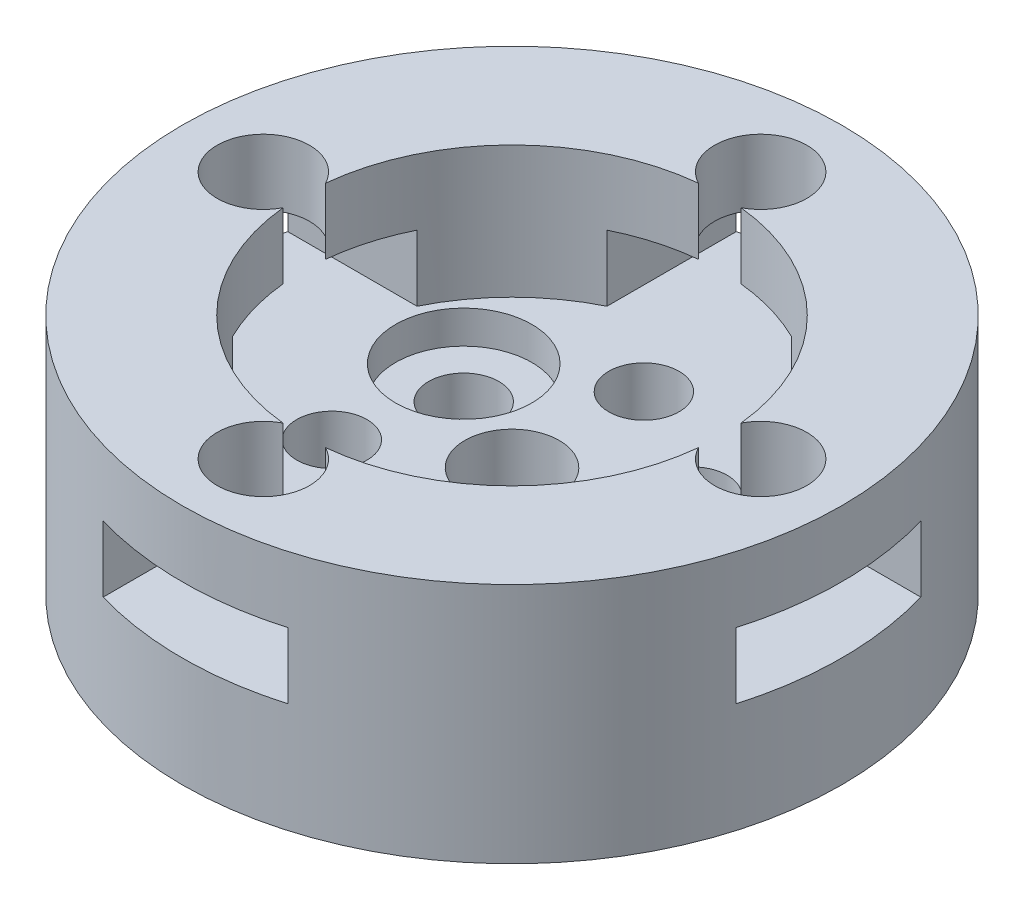
ISO-10303-21;
HEADER;
FILE_DESCRIPTION(('STEP AP214'),'2;1');
FILE_NAME('part.step','',(''),(''),'','','');
FILE_SCHEMA(('AUTOMOTIVE_DESIGN { 1 0 10303 214 1 1 1 1 }'));
ENDSEC;
DATA;
#1=APPLICATION_CONTEXT('core data for automotive mechanical design processes');
#2=APPLICATION_PROTOCOL_DEFINITION('international standard','automotive_design',2000,#1);
#3=PRODUCT_CONTEXT('',#1,'mechanical');
#4=PRODUCT('Part','Part','',(#3));
#5=PRODUCT_RELATED_PRODUCT_CATEGORY('part','',(#4));
#6=PRODUCT_DEFINITION_FORMATION('','',#4);
#7=PRODUCT_DEFINITION_CONTEXT('part definition',#1,'design');
#8=PRODUCT_DEFINITION('design','',#6,#7);
#9=PRODUCT_DEFINITION_SHAPE('','',#8);
#10=(LENGTH_UNIT() NAMED_UNIT(*) SI_UNIT(.MILLI.,.METRE.));
#11=(NAMED_UNIT(*) PLANE_ANGLE_UNIT() SI_UNIT($,.RADIAN.));
#12=(NAMED_UNIT(*) SI_UNIT($,.STERADIAN.) SOLID_ANGLE_UNIT());
#13=UNCERTAINTY_MEASURE_WITH_UNIT(LENGTH_MEASURE(1.E-05),#10,'distance_accuracy_value','');
#14=(GEOMETRIC_REPRESENTATION_CONTEXT(3) GLOBAL_UNCERTAINTY_ASSIGNED_CONTEXT((#13)) GLOBAL_UNIT_ASSIGNED_CONTEXT((#10,
#11,#12)) REPRESENTATION_CONTEXT('',''));
#15=CARTESIAN_POINT('',(0.,0.,0.));
#16=DIRECTION('',(0.,0.,1.));
#17=DIRECTION('',(1.,0.,0.));
#18=AXIS2_PLACEMENT_3D('',#15,#16,#17);
#19=CARTESIAN_POINT('',(0.,11.,0.));
#20=DIRECTION('',(0.,-1.,0.));
#21=DIRECTION('',(0.,0.,-1.));
#22=AXIS2_PLACEMENT_3D('',#19,#20,#21);
#23=CYLINDRICAL_SURFACE('',#22,15.);
#24=CARTESIAN_POINT('',(0.,5.,0.));
#25=DIRECTION('',(0.,-1.,0.));
#26=DIRECTION('',(0.,0.,-1.));
#27=AXIS2_PLACEMENT_3D('',#24,#25,#26);
#28=CIRCLE('',#27,15.);
#29=CARTESIAN_POINT('',(4.19999999999991,5.,-14.4));
#30=VERTEX_POINT('',#29);
#31=CARTESIAN_POINT('',(-4.20000000000009,5.,-14.4));
#32=VERTEX_POINT('',#31);
#33=EDGE_CURVE('E265',#30,#32,#28,.F.);
#34=ORIENTED_EDGE('',*,*,#33,.F.);
#35=DIRECTION('',(0.,-1.,0.));
#36=VECTOR('',#35,1.);
#37=CARTESIAN_POINT('',(4.19999999999991,11.,-14.4));
#38=LINE('',#37,#36);
#39=CARTESIAN_POINT('',(4.19999999999991,8.,-14.4));
#40=VERTEX_POINT('',#39);
#41=EDGE_CURVE('E269',#40,#30,#38,.T.);
#42=ORIENTED_EDGE('',*,*,#41,.F.);
#43=CARTESIAN_POINT('',(0.,8.,0.));
#44=DIRECTION('',(0.,-1.,0.));
#45=DIRECTION('',(0.,0.,-1.));
#46=AXIS2_PLACEMENT_3D('',#43,#44,#45);
#47=CIRCLE('',#46,15.);
#48=CARTESIAN_POINT('',(-4.20000000000009,8.,-14.4));
#49=VERTEX_POINT('',#48);
#50=EDGE_CURVE('E215',#40,#49,#47,.F.);
#51=ORIENTED_EDGE('',*,*,#50,.T.);
#52=DIRECTION('',(0.,-1.,0.));
#53=VECTOR('',#52,1.);
#54=CARTESIAN_POINT('',(-4.20000000000009,11.,-14.4));
#55=LINE('',#54,#53);
#56=EDGE_CURVE('E267',#32,#49,#55,.F.);
#57=ORIENTED_EDGE('',*,*,#56,.F.);
#58=EDGE_LOOP('',(#34,#42,#51,#57));
#59=FACE_BOUND('',#58,.T.);
#60=CARTESIAN_POINT('',(0.,5.,0.));
#61=DIRECTION('',(0.,-1.,0.));
#62=DIRECTION('',(0.,0.,-1.));
#63=AXIS2_PLACEMENT_3D('',#60,#61,#62);
#64=CIRCLE('',#63,15.);
#65=CARTESIAN_POINT('',(14.4000000000001,5.,4.19999999999958));
#66=VERTEX_POINT('',#65);
#67=CARTESIAN_POINT('',(14.3999999999999,5.,-4.20000000000042));
#68=VERTEX_POINT('',#67);
#69=EDGE_CURVE('E258',#66,#68,#64,.F.);
#70=ORIENTED_EDGE('',*,*,#69,.F.);
#71=DIRECTION('',(0.,-1.,0.));
#72=VECTOR('',#71,1.);
#73=CARTESIAN_POINT('',(14.4000000000001,11.,4.19999999999958));
#74=LINE('',#73,#72);
#75=CARTESIAN_POINT('',(14.4000000000001,8.,4.19999999999958));
#76=VERTEX_POINT('',#75);
#77=EDGE_CURVE('E263',#76,#66,#74,.T.);
#78=ORIENTED_EDGE('',*,*,#77,.F.);
#79=CARTESIAN_POINT('',(0.,8.,0.));
#80=DIRECTION('',(0.,-1.,0.));
#81=DIRECTION('',(0.,0.,-1.));
#82=AXIS2_PLACEMENT_3D('',#79,#80,#81);
#83=CIRCLE('',#82,15.);
#84=CARTESIAN_POINT('',(14.3999999999999,8.,-4.20000000000042));
#85=VERTEX_POINT('',#84);
#86=EDGE_CURVE('E236',#76,#85,#83,.F.);
#87=ORIENTED_EDGE('',*,*,#86,.T.);
#88=DIRECTION('',(0.,-1.,0.));
#89=VECTOR('',#88,1.);
#90=CARTESIAN_POINT('',(14.3999999999999,11.,-4.20000000000042));
#91=LINE('',#90,#89);
#92=EDGE_CURVE('E260',#68,#85,#91,.F.);
#93=ORIENTED_EDGE('',*,*,#92,.F.);
#94=EDGE_LOOP('',(#70,#78,#87,#93));
#95=FACE_BOUND('',#94,.T.);
#96=CARTESIAN_POINT('',(0.,5.,0.));
#97=DIRECTION('',(0.,-1.,0.));
#98=DIRECTION('',(0.,0.,-1.));
#99=AXIS2_PLACEMENT_3D('',#96,#97,#98);
#100=CIRCLE('',#99,15.);
#101=CARTESIAN_POINT('',(-4.19999999999967,5.,14.4000000000001));
#102=VERTEX_POINT('',#101);
#103=CARTESIAN_POINT('',(4.20000000000033,5.,14.3999999999999));
#104=VERTEX_POINT('',#103);
#105=EDGE_CURVE('E251',#102,#104,#100,.F.);
#106=ORIENTED_EDGE('',*,*,#105,.F.);
#107=DIRECTION('',(0.,-1.,0.));
#108=VECTOR('',#107,1.);
#109=CARTESIAN_POINT('',(-4.19999999999967,11.,14.4000000000001));
#110=LINE('',#109,#108);
#111=CARTESIAN_POINT('',(-4.19999999999967,8.,14.4000000000001));
#112=VERTEX_POINT('',#111);
#113=EDGE_CURVE('E256',#112,#102,#110,.T.);
#114=ORIENTED_EDGE('',*,*,#113,.F.);
#115=CARTESIAN_POINT('',(0.,8.,0.));
#116=DIRECTION('',(0.,-1.,0.));
#117=DIRECTION('',(0.,0.,-1.));
#118=AXIS2_PLACEMENT_3D('',#115,#116,#117);
#119=CIRCLE('',#118,15.);
#120=CARTESIAN_POINT('',(4.20000000000033,8.,14.3999999999999));
#121=VERTEX_POINT('',#120);
#122=EDGE_CURVE('E242',#112,#121,#119,.F.);
#123=ORIENTED_EDGE('',*,*,#122,.T.);
#124=DIRECTION('',(0.,-1.,0.));
#125=VECTOR('',#124,1.);
#126=CARTESIAN_POINT('',(4.20000000000033,11.,14.3999999999999));
#127=LINE('',#126,#125);
#128=EDGE_CURVE('E253',#104,#121,#127,.F.);
#129=ORIENTED_EDGE('',*,*,#128,.F.);
#130=EDGE_LOOP('',(#106,#114,#123,#129));
#131=FACE_BOUND('',#130,.T.);
#132=CARTESIAN_POINT('',(0.,11.,0.));
#133=DIRECTION('',(0.,-1.,0.));
#134=DIRECTION('',(0.,0.,-1.));
#135=AXIS2_PLACEMENT_3D('',#132,#133,#134);
#136=CIRCLE('',#135,15.);
#137=CARTESIAN_POINT('',(0.,11.,-15.));
#138=VERTEX_POINT('',#137);
#139=EDGE_CURVE('E300',#138,#138,#136,.T.);
#140=ORIENTED_EDGE('',*,*,#139,.T.);
#141=EDGE_LOOP('',(#140));
#142=FACE_BOUND('',#141,.T.);
#143=CARTESIAN_POINT('',(0.,0.,0.));
#144=DIRECTION('',(0.,-1.,0.));
#145=DIRECTION('',(0.,0.,-1.));
#146=AXIS2_PLACEMENT_3D('',#143,#144,#145);
#147=CIRCLE('',#146,15.);
#148=CARTESIAN_POINT('',(0.,0.,-15.));
#149=VERTEX_POINT('',#148);
#150=EDGE_CURVE('E298',#149,#149,#147,.T.);
#151=ORIENTED_EDGE('',*,*,#150,.F.);
#152=EDGE_LOOP('',(#151));
#153=FACE_BOUND('',#152,.T.);
#154=DIRECTION('',(0.,-1.,0.));
#155=VECTOR('',#154,1.);
#156=CARTESIAN_POINT('',(-14.4,11.,4.2));
#157=LINE('',#156,#155);
#158=CARTESIAN_POINT('',(-14.4,5.,4.2));
#159=VERTEX_POINT('',#158);
#160=CARTESIAN_POINT('',(-14.4,8.,4.2));
#161=VERTEX_POINT('',#160);
#162=EDGE_CURVE('E274',#159,#161,#157,.F.);
#163=ORIENTED_EDGE('',*,*,#162,.F.);
#164=CARTESIAN_POINT('',(0.,5.,0.));
#165=DIRECTION('',(0.,1.,0.));
#166=DIRECTION('',(0.,0.,1.));
#167=AXIS2_PLACEMENT_3D('',#164,#165,#166);
#168=CIRCLE('',#167,15.);
#169=CARTESIAN_POINT('',(-14.4,5.,-4.2));
#170=VERTEX_POINT('',#169);
#171=EDGE_CURVE('E271',#159,#170,#168,.F.);
#172=ORIENTED_EDGE('',*,*,#171,.T.);
#173=DIRECTION('',(0.,-1.,0.));
#174=VECTOR('',#173,1.);
#175=CARTESIAN_POINT('',(-14.4,11.,-4.2));
#176=LINE('',#175,#174);
#177=CARTESIAN_POINT('',(-14.4,8.,-4.2));
#178=VERTEX_POINT('',#177);
#179=EDGE_CURVE('E276',#178,#170,#176,.T.);
#180=ORIENTED_EDGE('',*,*,#179,.F.);
#181=CARTESIAN_POINT('',(0.,8.,0.));
#182=DIRECTION('',(0.,1.,0.));
#183=DIRECTION('',(0.,0.,1.));
#184=AXIS2_PLACEMENT_3D('',#181,#182,#183);
#185=CIRCLE('',#184,15.);
#186=EDGE_CURVE('E249',#161,#178,#185,.F.);
#187=ORIENTED_EDGE('',*,*,#186,.F.);
#188=EDGE_LOOP('',(#163,#172,#180,#187));
#189=FACE_BOUND('',#188,.T.);
#190=ADVANCED_FACE('F36',(#59,#95,#131,#142,#153,#189),#23,.T.);
#191=CARTESIAN_POINT('',(0.,11.,0.));
#192=DIRECTION('',(0.,-1.,0.));
#193=DIRECTION('',(0.,0.,-1.));
#194=AXIS2_PLACEMENT_3D('',#191,#192,#193);
#195=CYLINDRICAL_SURFACE('',#194,9.5);
#196=CARTESIAN_POINT('',(0.,5.,0.));
#197=DIRECTION('',(0.,1.,0.));
#198=DIRECTION('',(0.,0.,1.));
#199=AXIS2_PLACEMENT_3D('',#196,#197,#198);
#200=CIRCLE('',#199,9.5);
#201=CARTESIAN_POINT('',(-8.52115015710907,5.,4.2));
#202=VERTEX_POINT('',#201);
#203=CARTESIAN_POINT('',(-4.19999999999967,5.,8.52115015710923));
#204=VERTEX_POINT('',#203);
#205=EDGE_CURVE('E303',#202,#204,#200,.T.);
#206=ORIENTED_EDGE('',*,*,#205,.F.);
#207=DIRECTION('',(0.,-1.,0.));
#208=VECTOR('',#207,1.);
#209=CARTESIAN_POINT('',(-8.52115015710907,11.,4.2));
#210=LINE('',#209,#208);
#211=CARTESIAN_POINT('',(-8.52115015710907,8.,4.2));
#212=VERTEX_POINT('',#211);
#213=EDGE_CURVE('E11',#202,#212,#210,.F.);
#214=ORIENTED_EDGE('',*,*,#213,.T.);
#215=CARTESIAN_POINT('',(0.,8.,0.));
#216=DIRECTION('',(0.,1.,0.));
#217=DIRECTION('',(0.,0.,1.));
#218=AXIS2_PLACEMENT_3D('',#215,#216,#217);
#219=CIRCLE('',#218,9.5);
#220=CARTESIAN_POINT('',(-9.45048213055818,8.,0.968704031167638));
#221=VERTEX_POINT('',#220);
#222=EDGE_CURVE('E248',#212,#221,#219,.F.);
#223=ORIENTED_EDGE('',*,*,#222,.T.);
#224=DIRECTION('',(0.,1.,0.));
#225=VECTOR('',#224,1.);
#226=CARTESIAN_POINT('',(-9.45048213055818,9.5,0.968704031167638));
#227=LINE('',#226,#225);
#228=CARTESIAN_POINT('',(-9.45048213055818,11.,0.968704031167637));
#229=VERTEX_POINT('',#228);
#230=EDGE_CURVE('E358',#221,#229,#227,.T.);
#231=ORIENTED_EDGE('',*,*,#230,.T.);
#232=CARTESIAN_POINT('',(0.,11.,0.));
#233=DIRECTION('',(0.,-1.,0.));
#234=DIRECTION('',(0.,0.,-1.));
#235=AXIS2_PLACEMENT_3D('',#232,#233,#234);
#236=CIRCLE('',#235,9.5);
#237=CARTESIAN_POINT('',(-0.968704031167536,11.,9.45048213055819));
#238=VERTEX_POINT('',#237);
#239=EDGE_CURVE('E840',#238,#229,#236,.T.);
#240=ORIENTED_EDGE('',*,*,#239,.F.);
#241=DIRECTION('',(0.,1.,0.));
#242=VECTOR('',#241,1.);
#243=CARTESIAN_POINT('',(-0.96870403116754,9.5,9.4504821305582));
#244=LINE('',#243,#242);
#245=CARTESIAN_POINT('',(-0.968704031167536,8.,9.45048213055819));
#246=VERTEX_POINT('',#245);
#247=EDGE_CURVE('E373',#238,#246,#244,.F.);
#248=ORIENTED_EDGE('',*,*,#247,.T.);
#249=CARTESIAN_POINT('',(0.,8.,0.));
#250=DIRECTION('',(0.,-1.,0.));
#251=DIRECTION('',(0.,0.,-1.));
#252=AXIS2_PLACEMENT_3D('',#249,#250,#251);
#253=CIRCLE('',#252,9.5);
#254=CARTESIAN_POINT('',(-4.19999999999967,8.,8.52115015710923));
#255=VERTEX_POINT('',#254);
#256=EDGE_CURVE('E241',#255,#246,#253,.F.);
#257=ORIENTED_EDGE('',*,*,#256,.F.);
#258=DIRECTION('',(0.,-1.,0.));
#259=VECTOR('',#258,1.);
#260=CARTESIAN_POINT('',(-4.19999999999967,11.,8.52115015710923));
#261=LINE('',#260,#259);
#262=EDGE_CURVE('E389',#255,#204,#261,.T.);
#263=ORIENTED_EDGE('',*,*,#262,.T.);
#264=EDGE_LOOP('',(#206,#214,#223,#231,#240,#248,#257,#263));
#265=FACE_BOUND('',#264,.T.);
#266=ADVANCED_FACE('F421',(#265),#195,.F.);
#267=CARTESIAN_POINT('',(-9.45048213055819,8.,-0.96870403116762));
#268=VERTEX_POINT('',#267);
#269=CARTESIAN_POINT('',(-8.52115015710907,8.,-4.2));
#270=VERTEX_POINT('',#269);
#271=EDGE_CURVE('E245',#268,#270,#219,.F.);
#272=ORIENTED_EDGE('',*,*,#271,.T.);
#273=DIRECTION('',(0.,-1.,0.));
#274=VECTOR('',#273,1.);
#275=CARTESIAN_POINT('',(-8.52115015710907,11.,-4.2));
#276=LINE('',#275,#274);
#277=CARTESIAN_POINT('',(-8.52115015710907,5.,-4.2));
#278=VERTEX_POINT('',#277);
#279=EDGE_CURVE('E44',#270,#278,#276,.T.);
#280=ORIENTED_EDGE('',*,*,#279,.T.);
#281=CARTESIAN_POINT('',(-4.20000000000009,5.,-8.52115015710903));
#282=VERTEX_POINT('',#281);
#283=EDGE_CURVE('E403',#282,#278,#200,.T.);
#284=ORIENTED_EDGE('',*,*,#283,.F.);
#285=DIRECTION('',(0.,-1.,0.));
#286=VECTOR('',#285,1.);
#287=CARTESIAN_POINT('',(-4.20000000000009,11.,-8.52115015710903));
#288=LINE('',#287,#286);
#289=CARTESIAN_POINT('',(-4.20000000000009,8.,-8.52115015710903));
#290=VERTEX_POINT('',#289);
#291=EDGE_CURVE('E208',#282,#290,#288,.F.);
#292=ORIENTED_EDGE('',*,*,#291,.T.);
#293=CARTESIAN_POINT('',(0.,8.,0.));
#294=DIRECTION('',(0.,-1.,0.));
#295=DIRECTION('',(0.,0.,-1.));
#296=AXIS2_PLACEMENT_3D('',#293,#294,#295);
#297=CIRCLE('',#296,9.5);
#298=CARTESIAN_POINT('',(-0.968704031167415,8.,-9.45048213055821));
#299=VERTEX_POINT('',#298);
#300=EDGE_CURVE('E222',#299,#290,#297,.F.);
#301=ORIENTED_EDGE('',*,*,#300,.F.);
#302=DIRECTION('',(0.,1.,0.));
#303=VECTOR('',#302,1.);
#304=CARTESIAN_POINT('',(-0.968704031167414,9.5,-9.45048213055821));
#305=LINE('',#304,#303);
#306=CARTESIAN_POINT('',(-0.968704031167415,11.,-9.45048213055821));
#307=VERTEX_POINT('',#306);
#308=EDGE_CURVE('E382',#299,#307,#305,.T.);
#309=ORIENTED_EDGE('',*,*,#308,.T.);
#310=CARTESIAN_POINT('',(-9.45048213055819,11.,-0.96870403116762));
#311=VERTEX_POINT('',#310);
#312=EDGE_CURVE('E281',#311,#307,#236,.T.);
#313=ORIENTED_EDGE('',*,*,#312,.F.);
#314=DIRECTION('',(0.,1.,0.));
#315=VECTOR('',#314,1.);
#316=CARTESIAN_POINT('',(-9.45048213055819,9.5,-0.96870403116762));
#317=LINE('',#316,#315);
#318=EDGE_CURVE('E367',#311,#268,#317,.F.);
#319=ORIENTED_EDGE('',*,*,#318,.T.);
#320=EDGE_LOOP('',(#272,#280,#284,#292,#301,#309,#313,#319));
#321=FACE_BOUND('',#320,.T.);
#322=ADVANCED_FACE('F402',(#321),#195,.F.);
#323=CARTESIAN_POINT('',(0.,8.,0.));
#324=DIRECTION('',(0.,-1.,0.));
#325=DIRECTION('',(0.,0.,-1.));
#326=AXIS2_PLACEMENT_3D('',#323,#324,#325);
#327=CIRCLE('',#326,9.5);
#328=CARTESIAN_POINT('',(8.52115015710928,8.,4.19999999999958));
#329=VERTEX_POINT('',#328);
#330=CARTESIAN_POINT('',(9.4504821305582,8.,0.968704031167484));
#331=VERTEX_POINT('',#330);
#332=EDGE_CURVE('E235',#329,#331,#327,.F.);
#333=ORIENTED_EDGE('',*,*,#332,.F.);
#334=DIRECTION('',(0.,-1.,0.));
#335=VECTOR('',#334,1.);
#336=CARTESIAN_POINT('',(8.52115015710928,11.,4.19999999999958));
#337=LINE('',#336,#335);
#338=CARTESIAN_POINT('',(8.52115015710928,5.,4.19999999999958));
#339=VERTEX_POINT('',#338);
#340=EDGE_CURVE('E209',#329,#339,#337,.T.);
#341=ORIENTED_EDGE('',*,*,#340,.T.);
#342=CARTESIAN_POINT('',(4.20000000000033,5.,8.52115015710891));
#343=VERTEX_POINT('',#342);
#344=EDGE_CURVE('E306',#343,#339,#200,.T.);
#345=ORIENTED_EDGE('',*,*,#344,.F.);
#346=DIRECTION('',(0.,-1.,0.));
#347=VECTOR('',#346,1.);
#348=CARTESIAN_POINT('',(4.20000000000033,11.,8.52115015710891));
#349=LINE('',#348,#347);
#350=CARTESIAN_POINT('',(4.20000000000033,8.,8.52115015710891));
#351=VERTEX_POINT('',#350);
#352=EDGE_CURVE('E386',#343,#351,#349,.F.);
#353=ORIENTED_EDGE('',*,*,#352,.T.);
#354=CARTESIAN_POINT('',(0.968704031167545,8.,9.45048213055819));
#355=VERTEX_POINT('',#354);
#356=EDGE_CURVE('E239',#355,#351,#253,.F.);
#357=ORIENTED_EDGE('',*,*,#356,.F.);
#358=DIRECTION('',(0.,1.,0.));
#359=VECTOR('',#358,1.);
#360=CARTESIAN_POINT('',(0.968704031167549,9.5,9.4504821305582));
#361=LINE('',#360,#359);
#362=CARTESIAN_POINT('',(0.968704031167545,11.,9.45048213055819));
#363=VERTEX_POINT('',#362);
#364=EDGE_CURVE('E370',#355,#363,#361,.T.);
#365=ORIENTED_EDGE('',*,*,#364,.T.);
#366=CARTESIAN_POINT('',(9.4504821305582,11.,0.968704031167484));
#367=VERTEX_POINT('',#366);
#368=EDGE_CURVE('E299',#367,#363,#236,.T.);
#369=ORIENTED_EDGE('',*,*,#368,.F.);
#370=DIRECTION('',(0.,1.,0.));
#371=VECTOR('',#370,1.);
#372=CARTESIAN_POINT('',(9.45048213055821,9.5,0.968704031167491));
#373=LINE('',#372,#371);
#374=EDGE_CURVE('E379',#367,#331,#373,.F.);
#375=ORIENTED_EDGE('',*,*,#374,.T.);
#376=EDGE_LOOP('',(#333,#341,#345,#353,#357,#365,#369,#375));
#377=FACE_BOUND('',#376,.T.);
#378=ADVANCED_FACE('F530',(#377),#195,.F.);
#379=CARTESIAN_POINT('',(0.,5.,0.));
#380=DIRECTION('',(0.,1.,0.));
#381=DIRECTION('',(0.,0.,1.));
#382=AXIS2_PLACEMENT_3D('',#379,#380,#381);
#383=PLANE('',#382);
#384=ORIENTED_EDGE('',*,*,#283,.T.);
#385=DIRECTION('',(-1.,0.,0.));
#386=VECTOR('',#385,1.);
#387=CARTESIAN_POINT('',(-17.3137084989848,5.,-4.2));
#388=LINE('',#387,#386);
#389=EDGE_CURVE('E223',#278,#170,#388,.T.);
#390=ORIENTED_EDGE('',*,*,#389,.T.);
#391=ORIENTED_EDGE('',*,*,#171,.F.);
#392=DIRECTION('',(1.,0.,0.));
#393=VECTOR('',#392,1.);
#394=CARTESIAN_POINT('',(-17.3137084989848,5.,4.2));
#395=LINE('',#394,#393);
#396=EDGE_CURVE('E226',#159,#202,#395,.T.);
#397=ORIENTED_EDGE('',*,*,#396,.T.);
#398=ORIENTED_EDGE('',*,*,#205,.T.);
#399=DIRECTION('',(0.,0.,1.));
#400=VECTOR('',#399,1.);
#401=CARTESIAN_POINT('',(-4.19999999999967,5.,17.3137084989847));
#402=LINE('',#401,#400);
#403=EDGE_CURVE('E417',#204,#102,#402,.T.);
#404=ORIENTED_EDGE('',*,*,#403,.T.);
#405=ORIENTED_EDGE('',*,*,#105,.T.);
#406=DIRECTION('',(0.,0.,-1.));
#407=VECTOR('',#406,1.);
#408=CARTESIAN_POINT('',(4.20000000000033,5.,17.3137084989847));
#409=LINE('',#408,#407);
#410=EDGE_CURVE('E435',#104,#343,#409,.T.);
#411=ORIENTED_EDGE('',*,*,#410,.T.);
#412=ORIENTED_EDGE('',*,*,#344,.T.);
#413=DIRECTION('',(1.,0.,0.));
#414=VECTOR('',#413,1.);
#415=CARTESIAN_POINT('',(17.313708498985,5.,4.19999999999958));
#416=LINE('',#415,#414);
#417=EDGE_CURVE('E443',#339,#66,#416,.T.);
#418=ORIENTED_EDGE('',*,*,#417,.T.);
#419=ORIENTED_EDGE('',*,*,#69,.T.);
#420=DIRECTION('',(-1.,0.,0.));
#421=VECTOR('',#420,1.);
#422=CARTESIAN_POINT('',(17.313708498985,5.,-4.20000000000042));
#423=LINE('',#422,#421);
#424=CARTESIAN_POINT('',(8.52115015710887,5.,-4.20000000000042));
#425=VERTEX_POINT('',#424);
#426=EDGE_CURVE('E216',#68,#425,#423,.T.);
#427=ORIENTED_EDGE('',*,*,#426,.T.);
#428=CARTESIAN_POINT('',(4.19999999999991,5.,-8.52115015710912));
#429=VERTEX_POINT('',#428);
#430=EDGE_CURVE('E310',#425,#429,#200,.T.);
#431=ORIENTED_EDGE('',*,*,#430,.T.);
#432=DIRECTION('',(0.,0.,-1.));
#433=VECTOR('',#432,1.);
#434=CARTESIAN_POINT('',(4.19999999999991,5.,-17.3137084989851));
#435=LINE('',#434,#433);
#436=EDGE_CURVE('E203',#429,#30,#435,.T.);
#437=ORIENTED_EDGE('',*,*,#436,.T.);
#438=ORIENTED_EDGE('',*,*,#33,.T.);
#439=DIRECTION('',(0.,0.,1.));
#440=VECTOR('',#439,1.);
#441=CARTESIAN_POINT('',(-4.20000000000009,5.,-17.3137084989851));
#442=LINE('',#441,#440);
#443=EDGE_CURVE('E412',#32,#282,#442,.T.);
#444=ORIENTED_EDGE('',*,*,#443,.T.);
#445=EDGE_LOOP('',(#384,#390,#391,#397,#398,#404,#405,#411,#412,#418,#419,#427,#431,#437,#438,#444));
#446=FACE_BOUND('',#445,.T.);
#447=CARTESIAN_POINT('',(-5.19615242270664,5.,-3.));
#448=DIRECTION('',(0.,1.,0.));
#449=DIRECTION('',(0.,0.,1.));
#450=AXIS2_PLACEMENT_3D('',#447,#448,#449);
#451=CIRCLE('',#450,3.1);
#452=CARTESIAN_POINT('',(-5.19615242270664,5.,0.100000000000003));
#453=VERTEX_POINT('',#452);
#454=EDGE_CURVE('E315',#453,#453,#451,.T.);
#455=ORIENTED_EDGE('',*,*,#454,.F.);
#456=EDGE_LOOP('',(#455));
#457=FACE_BOUND('',#456,.T.);
#458=CARTESIAN_POINT('',(0.,5.,-6.));
#459=DIRECTION('',(0.,1.,0.));
#460=DIRECTION('',(0.,0.,1.));
#461=AXIS2_PLACEMENT_3D('',#458,#459,#460);
#462=CIRCLE('',#461,1.6);
#463=CARTESIAN_POINT('',(0.,5.,-4.4));
#464=VERTEX_POINT('',#463);
#465=EDGE_CURVE('E355',#464,#464,#462,.T.);
#466=ORIENTED_EDGE('',*,*,#465,.F.);
#467=EDGE_LOOP('',(#466));
#468=FACE_BOUND('',#467,.T.);
#469=CARTESIAN_POINT('',(5.19615242270637,5.,2.99999999999986));
#470=DIRECTION('',(0.,1.,0.));
#471=DIRECTION('',(0.,0.,1.));
#472=AXIS2_PLACEMENT_3D('',#469,#470,#471);
#473=CIRCLE('',#472,3.10000000000013);
#474=CARTESIAN_POINT('',(5.19615242270637,5.,6.09999999999998));
#475=VERTEX_POINT('',#474);
#476=EDGE_CURVE('E309',#475,#475,#473,.T.);
#477=ORIENTED_EDGE('',*,*,#476,.F.);
#478=EDGE_LOOP('',(#477));
#479=FACE_BOUND('',#478,.T.);
#480=CARTESIAN_POINT('',(0.,5.,6.));
#481=DIRECTION('',(0.,1.,0.));
#482=DIRECTION('',(0.,0.,1.));
#483=AXIS2_PLACEMENT_3D('',#480,#481,#482);
#484=CIRCLE('',#483,1.6);
#485=CARTESIAN_POINT('',(0.,5.,7.6));
#486=VERTEX_POINT('',#485);
#487=EDGE_CURVE('E334',#486,#486,#484,.T.);
#488=ORIENTED_EDGE('',*,*,#487,.F.);
#489=EDGE_LOOP('',(#488));
#490=FACE_BOUND('',#489,.T.);
#491=CARTESIAN_POINT('',(5.19615242270663,5.,-3.));
#492=DIRECTION('',(0.,1.,0.));
#493=DIRECTION('',(0.,0.,1.));
#494=AXIS2_PLACEMENT_3D('',#491,#492,#493);
#495=CIRCLE('',#494,1.6);
#496=CARTESIAN_POINT('',(5.19615242270663,5.,-1.4));
#497=VERTEX_POINT('',#496);
#498=EDGE_CURVE('E343',#497,#497,#495,.T.);
#499=ORIENTED_EDGE('',*,*,#498,.F.);
#500=EDGE_LOOP('',(#499));
#501=FACE_BOUND('',#500,.T.);
#502=CARTESIAN_POINT('',(0.,5.,0.));
#503=DIRECTION('',(0.,1.,0.));
#504=DIRECTION('',(0.,0.,1.));
#505=AXIS2_PLACEMENT_3D('',#502,#503,#504);
#506=CIRCLE('',#505,2.15);
#507=CARTESIAN_POINT('',(0.,5.,2.15));
#508=VERTEX_POINT('',#507);
#509=EDGE_CURVE('E349',#508,#508,#506,.T.);
#510=ORIENTED_EDGE('',*,*,#509,.F.);
#511=EDGE_LOOP('',(#510));
#512=FACE_BOUND('',#511,.T.);
#513=CARTESIAN_POINT('',(-5.19615242270663,5.,3.));
#514=DIRECTION('',(0.,1.,0.));
#515=DIRECTION('',(0.,0.,1.));
#516=AXIS2_PLACEMENT_3D('',#513,#514,#515);
#517=CIRCLE('',#516,1.6);
#518=CARTESIAN_POINT('',(-5.19615242270663,5.,4.6));
#519=VERTEX_POINT('',#518);
#520=EDGE_CURVE('E328',#519,#519,#517,.T.);
#521=ORIENTED_EDGE('',*,*,#520,.F.);
#522=EDGE_LOOP('',(#521));
#523=FACE_BOUND('',#522,.T.);
#524=ADVANCED_FACE('F409',(#446,#457,#468,#479,#490,#501,#512,#523),#383,.T.);
#525=CARTESIAN_POINT('',(5.19615242270663,5.,3.));
#526=DIRECTION('',(0.,-1.,0.));
#527=DIRECTION('',(0.,0.,-1.));
#528=AXIS2_PLACEMENT_3D('',#525,#526,#527);
#529=CYLINDRICAL_SURFACE('',#528,1.6);
#530=CARTESIAN_POINT('',(5.19615242270663,0.,3.));
#531=DIRECTION('',(0.,1.,0.));
#532=DIRECTION('',(0.,0.,1.));
#533=AXIS2_PLACEMENT_3D('',#530,#531,#532);
#534=CIRCLE('',#533,1.6);
#535=CARTESIAN_POINT('',(5.19615242270663,0.,4.6));
#536=VERTEX_POINT('',#535);
#537=EDGE_CURVE('E337',#536,#536,#534,.T.);
#538=ORIENTED_EDGE('',*,*,#537,.F.);
#539=EDGE_LOOP('',(#538));
#540=FACE_BOUND('',#539,.T.);
#541=CARTESIAN_POINT('',(5.19615242270663,3.5,3.));
#542=DIRECTION('',(0.,1.,0.));
#543=DIRECTION('',(0.,0.,1.));
#544=AXIS2_PLACEMENT_3D('',#541,#542,#543);
#545=CIRCLE('',#544,1.6);
#546=CARTESIAN_POINT('',(5.19615242270663,3.5,4.6));
#547=VERTEX_POINT('',#546);
#548=EDGE_CURVE('E327',#547,#547,#545,.T.);
#549=ORIENTED_EDGE('',*,*,#548,.T.);
#550=EDGE_LOOP('',(#549));
#551=FACE_BOUND('',#550,.T.);
#552=ADVANCED_FACE('F506',(#540,#551),#529,.F.);
#553=CARTESIAN_POINT('',(-5.19615242270664,5.,-3.));
#554=DIRECTION('',(0.,-1.,0.));
#555=DIRECTION('',(0.,0.,-1.));
#556=AXIS2_PLACEMENT_3D('',#553,#554,#555);
#557=CYLINDRICAL_SURFACE('',#556,1.6);
#558=CARTESIAN_POINT('',(-5.19615242270664,0.,-3.));
#559=DIRECTION('',(0.,1.,0.));
#560=DIRECTION('',(0.,0.,1.));
#561=AXIS2_PLACEMENT_3D('',#558,#559,#560);
#562=CIRCLE('',#561,1.6);
#563=CARTESIAN_POINT('',(-5.19615242270664,0.,-1.4));
#564=VERTEX_POINT('',#563);
#565=EDGE_CURVE('E323',#564,#564,#562,.T.);
#566=ORIENTED_EDGE('',*,*,#565,.F.);
#567=EDGE_LOOP('',(#566));
#568=FACE_BOUND('',#567,.T.);
#569=CARTESIAN_POINT('',(-5.19615242270664,3.5,-3.));
#570=DIRECTION('',(0.,1.,0.));
#571=DIRECTION('',(0.,0.,1.));
#572=AXIS2_PLACEMENT_3D('',#569,#570,#571);
#573=CIRCLE('',#572,1.6);
#574=CARTESIAN_POINT('',(-5.19615242270664,3.5,-1.4));
#575=VERTEX_POINT('',#574);
#576=EDGE_CURVE('E314',#575,#575,#573,.T.);
#577=ORIENTED_EDGE('',*,*,#576,.T.);
#578=EDGE_LOOP('',(#577));
#579=FACE_BOUND('',#578,.T.);
#580=ADVANCED_FACE('F503',(#568,#579),#557,.F.);
#581=CARTESIAN_POINT('',(0.,0.,0.));
#582=DIRECTION('',(0.,1.,0.));
#583=DIRECTION('',(0.,0.,1.));
#584=AXIS2_PLACEMENT_3D('',#581,#582,#583);
#585=PLANE('',#584);
#586=ORIENTED_EDGE('',*,*,#150,.T.);
#587=EDGE_LOOP('',(#586));
#588=FACE_BOUND('',#587,.T.);
#589=ORIENTED_EDGE('',*,*,#565,.T.);
#590=EDGE_LOOP('',(#589));
#591=FACE_BOUND('',#590,.T.);
#592=CARTESIAN_POINT('',(-5.19615242270663,0.,3.));
#593=DIRECTION('',(0.,1.,0.));
#594=DIRECTION('',(0.,0.,1.));
#595=AXIS2_PLACEMENT_3D('',#592,#593,#594);
#596=CIRCLE('',#595,1.6);
#597=CARTESIAN_POINT('',(-5.19615242270663,0.,4.6));
#598=VERTEX_POINT('',#597);
#599=EDGE_CURVE('E326',#598,#598,#596,.T.);
#600=ORIENTED_EDGE('',*,*,#599,.T.);
#601=EDGE_LOOP('',(#600));
#602=FACE_BOUND('',#601,.T.);
#603=CARTESIAN_POINT('',(0.,0.,6.));
#604=DIRECTION('',(0.,1.,0.));
#605=DIRECTION('',(0.,0.,1.));
#606=AXIS2_PLACEMENT_3D('',#603,#604,#605);
#607=CIRCLE('',#606,1.6);
#608=CARTESIAN_POINT('',(0.,0.,7.6));
#609=VERTEX_POINT('',#608);
#610=EDGE_CURVE('E331',#609,#609,#607,.T.);
#611=ORIENTED_EDGE('',*,*,#610,.T.);
#612=EDGE_LOOP('',(#611));
#613=FACE_BOUND('',#612,.T.);
#614=ORIENTED_EDGE('',*,*,#537,.T.);
#615=EDGE_LOOP('',(#614));
#616=FACE_BOUND('',#615,.T.);
#617=CARTESIAN_POINT('',(5.19615242270663,0.,-3.));
#618=DIRECTION('',(0.,1.,0.));
#619=DIRECTION('',(0.,0.,1.));
#620=AXIS2_PLACEMENT_3D('',#617,#618,#619);
#621=CIRCLE('',#620,1.6);
#622=CARTESIAN_POINT('',(5.19615242270663,0.,-1.4));
#623=VERTEX_POINT('',#622);
#624=EDGE_CURVE('E342',#623,#623,#621,.T.);
#625=ORIENTED_EDGE('',*,*,#624,.T.);
#626=EDGE_LOOP('',(#625));
#627=FACE_BOUND('',#626,.T.);
#628=CARTESIAN_POINT('',(0.,0.,0.));
#629=DIRECTION('',(0.,1.,0.));
#630=DIRECTION('',(0.,0.,1.));
#631=AXIS2_PLACEMENT_3D('',#628,#629,#630);
#632=CIRCLE('',#631,2.15);
#633=CARTESIAN_POINT('',(0.,0.,2.15));
#634=VERTEX_POINT('',#633);
#635=EDGE_CURVE('E346',#634,#634,#632,.T.);
#636=ORIENTED_EDGE('',*,*,#635,.T.);
#637=EDGE_LOOP('',(#636));
#638=FACE_BOUND('',#637,.T.);
#639=CARTESIAN_POINT('',(0.,0.,-6.));
#640=DIRECTION('',(0.,1.,0.));
#641=DIRECTION('',(0.,0.,1.));
#642=AXIS2_PLACEMENT_3D('',#639,#640,#641);
#643=CIRCLE('',#642,1.6);
#644=CARTESIAN_POINT('',(0.,0.,-4.4));
#645=VERTEX_POINT('',#644);
#646=EDGE_CURVE('E352',#645,#645,#643,.T.);
#647=ORIENTED_EDGE('',*,*,#646,.T.);
#648=EDGE_LOOP('',(#647));
#649=FACE_BOUND('',#648,.T.);
#650=ADVANCED_FACE('F38',(#588,#591,#602,#613,#616,#627,#638,#649),#585,.F.);
#651=CARTESIAN_POINT('',(0.,5.,-6.));
#652=DIRECTION('',(0.,-1.,0.));
#653=DIRECTION('',(0.,0.,-1.));
#654=AXIS2_PLACEMENT_3D('',#651,#652,#653);
#655=CYLINDRICAL_SURFACE('',#654,1.6);
#656=ORIENTED_EDGE('',*,*,#465,.T.);
#657=EDGE_LOOP('',(#656));
#658=FACE_BOUND('',#657,.T.);
#659=ORIENTED_EDGE('',*,*,#646,.F.);
#660=EDGE_LOOP('',(#659));
#661=FACE_BOUND('',#660,.T.);
#662=ADVANCED_FACE('F525',(#658,#661),#655,.F.);
#663=CARTESIAN_POINT('',(0.,5.,0.));
#664=DIRECTION('',(0.,-1.,0.));
#665=DIRECTION('',(0.,0.,-1.));
#666=AXIS2_PLACEMENT_3D('',#663,#664,#665);
#667=CYLINDRICAL_SURFACE('',#666,2.15);
#668=ORIENTED_EDGE('',*,*,#509,.T.);
#669=EDGE_LOOP('',(#668));
#670=FACE_BOUND('',#669,.T.);
#671=ORIENTED_EDGE('',*,*,#635,.F.);
#672=EDGE_LOOP('',(#671));
#673=FACE_BOUND('',#672,.T.);
#674=ADVANCED_FACE('F521',(#670,#673),#667,.F.);
#675=CARTESIAN_POINT('',(5.19615242270663,5.,-3.));
#676=DIRECTION('',(0.,-1.,0.));
#677=DIRECTION('',(0.,0.,-1.));
#678=AXIS2_PLACEMENT_3D('',#675,#676,#677);
#679=CYLINDRICAL_SURFACE('',#678,1.6);
#680=ORIENTED_EDGE('',*,*,#498,.T.);
#681=EDGE_LOOP('',(#680));
#682=FACE_BOUND('',#681,.T.);
#683=ORIENTED_EDGE('',*,*,#624,.F.);
#684=EDGE_LOOP('',(#683));
#685=FACE_BOUND('',#684,.T.);
#686=ADVANCED_FACE('F514',(#682,#685),#679,.F.);
#687=CARTESIAN_POINT('',(0.,5.,6.));
#688=DIRECTION('',(0.,-1.,0.));
#689=DIRECTION('',(0.,0.,-1.));
#690=AXIS2_PLACEMENT_3D('',#687,#688,#689);
#691=CYLINDRICAL_SURFACE('',#690,1.6);
#692=ORIENTED_EDGE('',*,*,#487,.T.);
#693=EDGE_LOOP('',(#692));
#694=FACE_BOUND('',#693,.T.);
#695=ORIENTED_EDGE('',*,*,#610,.F.);
#696=EDGE_LOOP('',(#695));
#697=FACE_BOUND('',#696,.T.);
#698=ADVANCED_FACE('F510',(#694,#697),#691,.F.);
#699=CARTESIAN_POINT('',(-5.19615242270663,5.,3.));
#700=DIRECTION('',(0.,-1.,0.));
#701=DIRECTION('',(0.,0.,-1.));
#702=AXIS2_PLACEMENT_3D('',#699,#700,#701);
#703=CYLINDRICAL_SURFACE('',#702,1.6);
#704=ORIENTED_EDGE('',*,*,#520,.T.);
#705=EDGE_LOOP('',(#704));
#706=FACE_BOUND('',#705,.T.);
#707=ORIENTED_EDGE('',*,*,#599,.F.);
#708=EDGE_LOOP('',(#707));
#709=FACE_BOUND('',#708,.T.);
#710=ADVANCED_FACE('F494',(#706,#709),#703,.F.);
#711=CARTESIAN_POINT('',(-5.19615242270664,3.5,-3.));
#712=DIRECTION('',(0.,1.,0.));
#713=DIRECTION('',(0.,0.,1.));
#714=AXIS2_PLACEMENT_3D('',#711,#712,#713);
#715=CYLINDRICAL_SURFACE('',#714,3.1);
#716=CARTESIAN_POINT('',(-5.19615242270664,3.5,-3.));
#717=DIRECTION('',(0.,1.,0.));
#718=DIRECTION('',(0.,0.,1.));
#719=AXIS2_PLACEMENT_3D('',#716,#717,#718);
#720=CIRCLE('',#719,3.1);
#721=CARTESIAN_POINT('',(-5.19615242270664,3.5,0.100000000000003));
#722=VERTEX_POINT('',#721);
#723=EDGE_CURVE('E311',#722,#722,#720,.T.);
#724=ORIENTED_EDGE('',*,*,#723,.F.);
#725=EDGE_LOOP('',(#724));
#726=FACE_BOUND('',#725,.T.);
#727=ORIENTED_EDGE('',*,*,#454,.T.);
#728=EDGE_LOOP('',(#727));
#729=FACE_BOUND('',#728,.T.);
#730=ADVANCED_FACE('F490',(#726,#729),#715,.F.);
#731=CARTESIAN_POINT('',(-5.19615242270664,3.5,-3.));
#732=DIRECTION('',(0.,1.,0.));
#733=DIRECTION('',(0.,0.,1.));
#734=AXIS2_PLACEMENT_3D('',#731,#732,#733);
#735=PLANE('',#734);
#736=ORIENTED_EDGE('',*,*,#576,.F.);
#737=EDGE_LOOP('',(#736));
#738=FACE_BOUND('',#737,.T.);
#739=ORIENTED_EDGE('',*,*,#723,.T.);
#740=EDGE_LOOP('',(#739));
#741=FACE_BOUND('',#740,.T.);
#742=ADVANCED_FACE('F486',(#738,#741),#735,.T.);
#743=CARTESIAN_POINT('',(5.19615242270637,3.5,2.99999999999986));
#744=DIRECTION('',(0.,1.,0.));
#745=DIRECTION('',(0.,0.,1.));
#746=AXIS2_PLACEMENT_3D('',#743,#744,#745);
#747=CYLINDRICAL_SURFACE('',#746,3.10000000000013);
#748=CARTESIAN_POINT('',(5.19615242270637,3.5,2.99999999999986));
#749=DIRECTION('',(0.,1.,0.));
#750=DIRECTION('',(0.,0.,1.));
#751=AXIS2_PLACEMENT_3D('',#748,#749,#750);
#752=CIRCLE('',#751,3.10000000000013);
#753=CARTESIAN_POINT('',(5.19615242270637,3.5,6.09999999999998));
#754=VERTEX_POINT('',#753);
#755=EDGE_CURVE('E318',#754,#754,#752,.T.);
#756=ORIENTED_EDGE('',*,*,#755,.F.);
#757=EDGE_LOOP('',(#756));
#758=FACE_BOUND('',#757,.T.);
#759=ORIENTED_EDGE('',*,*,#476,.T.);
#760=EDGE_LOOP('',(#759));
#761=FACE_BOUND('',#760,.T.);
#762=ADVANCED_FACE('F489',(#758,#761),#747,.F.);
#763=CARTESIAN_POINT('',(5.19615242270637,3.5,2.99999999999986));
#764=DIRECTION('',(0.,1.,0.));
#765=DIRECTION('',(0.,0.,1.));
#766=AXIS2_PLACEMENT_3D('',#763,#764,#765);
#767=PLANE('',#766);
#768=ORIENTED_EDGE('',*,*,#548,.F.);
#769=EDGE_LOOP('',(#768));
#770=FACE_BOUND('',#769,.T.);
#771=ORIENTED_EDGE('',*,*,#755,.T.);
#772=EDGE_LOOP('',(#771));
#773=FACE_BOUND('',#772,.T.);
#774=ADVANCED_FACE('F496',(#770,#773),#767,.T.);
#775=CARTESIAN_POINT('',(0.,11.,0.));
#776=DIRECTION('',(0.,-1.,0.));
#777=DIRECTION('',(0.,0.,-1.));
#778=AXIS2_PLACEMENT_3D('',#775,#776,#777);
#779=PLANE('',#778);
#780=ORIENTED_EDGE('',*,*,#312,.T.);
#781=CARTESIAN_POINT('',(0.,11.,-11.3137084989848));
#782=DIRECTION('',(0.,1.,0.));
#783=DIRECTION('',(0.,0.,1.));
#784=AXIS2_PLACEMENT_3D('',#781,#782,#783);
#785=CIRCLE('',#784,2.1);
#786=CARTESIAN_POINT('',(0.968704031167412,11.,-9.45048213055821));
#787=VERTEX_POINT('',#786);
#788=EDGE_CURVE('E282',#787,#307,#785,.T.);
#789=ORIENTED_EDGE('',*,*,#788,.F.);
#790=CARTESIAN_POINT('',(9.4504821305582,11.,-0.968704031167486));
#791=VERTEX_POINT('',#790);
#792=EDGE_CURVE('E295',#787,#791,#236,.T.);
#793=ORIENTED_EDGE('',*,*,#792,.T.);
#794=CARTESIAN_POINT('',(11.3137084989848,11.,0.));
#795=DIRECTION('',(0.,1.,0.));
#796=DIRECTION('',(0.,0.,1.));
#797=AXIS2_PLACEMENT_3D('',#794,#795,#796);
#798=CIRCLE('',#797,2.10000000000004);
#799=EDGE_CURVE('E286',#367,#791,#798,.T.);
#800=ORIENTED_EDGE('',*,*,#799,.F.);
#801=ORIENTED_EDGE('',*,*,#368,.T.);
#802=CARTESIAN_POINT('',(0.,11.,11.3137084989848));
#803=DIRECTION('',(0.,1.,0.));
#804=DIRECTION('',(0.,0.,1.));
#805=AXIS2_PLACEMENT_3D('',#802,#803,#804);
#806=CIRCLE('',#805,2.10000000000008);
#807=EDGE_CURVE('E290',#238,#363,#806,.T.);
#808=ORIENTED_EDGE('',*,*,#807,.F.);
#809=ORIENTED_EDGE('',*,*,#239,.T.);
#810=CARTESIAN_POINT('',(-11.3137084989848,11.,0.));
#811=DIRECTION('',(0.,1.,0.));
#812=DIRECTION('',(0.,0.,1.));
#813=AXIS2_PLACEMENT_3D('',#810,#811,#812);
#814=CIRCLE('',#813,2.10000000000012);
#815=EDGE_CURVE('E278',#311,#229,#814,.T.);
#816=ORIENTED_EDGE('',*,*,#815,.F.);
#817=EDGE_LOOP('',(#780,#789,#793,#800,#801,#808,#809,#816));
#818=FACE_BOUND('',#817,.T.);
#819=ORIENTED_EDGE('',*,*,#139,.F.);
#820=EDGE_LOOP('',(#819));
#821=FACE_BOUND('',#820,.T.);
#822=ADVANCED_FACE('F485',(#818,#821),#779,.F.);
#823=CARTESIAN_POINT('',(4.19999999999991,8.,-8.52115015710912));
#824=VERTEX_POINT('',#823);
#825=CARTESIAN_POINT('',(0.968704031167412,8.,-9.45048213055821));
#826=VERTEX_POINT('',#825);
#827=EDGE_CURVE('E212',#824,#826,#297,.F.);
#828=ORIENTED_EDGE('',*,*,#827,.F.);
#829=DIRECTION('',(0.,-1.,0.));
#830=VECTOR('',#829,1.);
#831=CARTESIAN_POINT('',(4.19999999999991,11.,-8.52115015710912));
#832=LINE('',#831,#830);
#833=EDGE_CURVE('E197',#824,#429,#832,.T.);
#834=ORIENTED_EDGE('',*,*,#833,.T.);
#835=ORIENTED_EDGE('',*,*,#430,.F.);
#836=DIRECTION('',(0.,-1.,0.));
#837=VECTOR('',#836,1.);
#838=CARTESIAN_POINT('',(8.52115015710887,11.,-4.20000000000042));
#839=LINE('',#838,#837);
#840=CARTESIAN_POINT('',(8.52115015710887,8.,-4.20000000000042));
#841=VERTEX_POINT('',#840);
#842=EDGE_CURVE('E392',#425,#841,#839,.F.);
#843=ORIENTED_EDGE('',*,*,#842,.T.);
#844=CARTESIAN_POINT('',(9.4504821305582,8.,-0.968704031167486));
#845=VERTEX_POINT('',#844);
#846=EDGE_CURVE('E233',#845,#841,#327,.F.);
#847=ORIENTED_EDGE('',*,*,#846,.F.);
#848=DIRECTION('',(0.,1.,0.));
#849=VECTOR('',#848,1.);
#850=CARTESIAN_POINT('',(9.45048213055821,9.5,-0.968704031167494));
#851=LINE('',#850,#849);
#852=EDGE_CURVE('E376',#845,#791,#851,.T.);
#853=ORIENTED_EDGE('',*,*,#852,.T.);
#854=ORIENTED_EDGE('',*,*,#792,.F.);
#855=DIRECTION('',(0.,1.,0.));
#856=VECTOR('',#855,1.);
#857=CARTESIAN_POINT('',(0.968704031167411,9.5,-9.45048213055821));
#858=LINE('',#857,#856);
#859=EDGE_CURVE('E221',#787,#826,#858,.F.);
#860=ORIENTED_EDGE('',*,*,#859,.T.);
#861=EDGE_LOOP('',(#828,#834,#835,#843,#847,#853,#854,#860));
#862=FACE_BOUND('',#861,.T.);
#863=ADVANCED_FACE('F219',(#862),#195,.F.);
#864=CARTESIAN_POINT('',(-11.3137084989848,8.,0.));
#865=DIRECTION('',(0.,1.,0.));
#866=DIRECTION('',(0.,0.,1.));
#867=AXIS2_PLACEMENT_3D('',#864,#865,#866);
#868=CYLINDRICAL_SURFACE('',#867,2.10000000000012);
#869=ORIENTED_EDGE('',*,*,#815,.T.);
#870=ORIENTED_EDGE('',*,*,#230,.F.);
#871=CARTESIAN_POINT('',(-11.3137084989848,8.,0.));
#872=DIRECTION('',(0.,1.,0.));
#873=DIRECTION('',(0.,0.,1.));
#874=AXIS2_PLACEMENT_3D('',#871,#872,#873);
#875=CIRCLE('',#874,2.10000000000012);
#876=EDGE_CURVE('E292',#268,#221,#875,.T.);
#877=ORIENTED_EDGE('',*,*,#876,.F.);
#878=ORIENTED_EDGE('',*,*,#318,.F.);
#879=EDGE_LOOP('',(#869,#870,#877,#878));
#880=FACE_BOUND('',#879,.T.);
#881=ADVANCED_FACE('F541',(#880),#868,.F.);
#882=CARTESIAN_POINT('',(0.,8.,11.3137084989848));
#883=DIRECTION('',(0.,1.,0.));
#884=DIRECTION('',(0.,0.,1.));
#885=AXIS2_PLACEMENT_3D('',#882,#883,#884);
#886=CYLINDRICAL_SURFACE('',#885,2.10000000000008);
#887=ORIENTED_EDGE('',*,*,#807,.T.);
#888=ORIENTED_EDGE('',*,*,#364,.F.);
#889=CARTESIAN_POINT('',(0.,8.,11.3137084989848));
#890=DIRECTION('',(0.,1.,0.));
#891=DIRECTION('',(0.,0.,1.));
#892=AXIS2_PLACEMENT_3D('',#889,#890,#891);
#893=CIRCLE('',#892,2.10000000000008);
#894=EDGE_CURVE('E288',#246,#355,#893,.T.);
#895=ORIENTED_EDGE('',*,*,#894,.F.);
#896=ORIENTED_EDGE('',*,*,#247,.F.);
#897=EDGE_LOOP('',(#887,#888,#895,#896));
#898=FACE_BOUND('',#897,.T.);
#899=ADVANCED_FACE('F546',(#898),#886,.F.);
#900=CARTESIAN_POINT('',(11.3137084989848,8.,0.));
#901=DIRECTION('',(0.,1.,0.));
#902=DIRECTION('',(0.,0.,1.));
#903=AXIS2_PLACEMENT_3D('',#900,#901,#902);
#904=CYLINDRICAL_SURFACE('',#903,2.10000000000004);
#905=ORIENTED_EDGE('',*,*,#799,.T.);
#906=ORIENTED_EDGE('',*,*,#852,.F.);
#907=CARTESIAN_POINT('',(11.3137084989848,8.,0.));
#908=DIRECTION('',(0.,1.,0.));
#909=DIRECTION('',(0.,0.,1.));
#910=AXIS2_PLACEMENT_3D('',#907,#908,#909);
#911=CIRCLE('',#910,2.10000000000004);
#912=EDGE_CURVE('E284',#331,#845,#911,.T.);
#913=ORIENTED_EDGE('',*,*,#912,.F.);
#914=ORIENTED_EDGE('',*,*,#374,.F.);
#915=EDGE_LOOP('',(#905,#906,#913,#914));
#916=FACE_BOUND('',#915,.T.);
#917=ADVANCED_FACE('F683',(#916),#904,.F.);
#918=CARTESIAN_POINT('',(0.,8.,-11.3137084989848));
#919=DIRECTION('',(0.,1.,0.));
#920=DIRECTION('',(0.,0.,1.));
#921=AXIS2_PLACEMENT_3D('',#918,#919,#920);
#922=CYLINDRICAL_SURFACE('',#921,2.1);
#923=ORIENTED_EDGE('',*,*,#788,.T.);
#924=ORIENTED_EDGE('',*,*,#308,.F.);
#925=CARTESIAN_POINT('',(0.,8.,-11.3137084989848));
#926=DIRECTION('',(0.,1.,0.));
#927=DIRECTION('',(0.,0.,1.));
#928=AXIS2_PLACEMENT_3D('',#925,#926,#927);
#929=CIRCLE('',#928,2.1);
#930=EDGE_CURVE('E279',#826,#299,#929,.T.);
#931=ORIENTED_EDGE('',*,*,#930,.F.);
#932=ORIENTED_EDGE('',*,*,#859,.F.);
#933=EDGE_LOOP('',(#923,#924,#931,#932));
#934=FACE_BOUND('',#933,.T.);
#935=ADVANCED_FACE('F692',(#934),#922,.F.);
#936=CARTESIAN_POINT('',(4.19999999999991,5.,-17.3137084989851));
#937=DIRECTION('',(1.,0.,0.));
#938=DIRECTION('',(0.,0.,-1.));
#939=AXIS2_PLACEMENT_3D('',#936,#937,#938);
#940=PLANE('',#939);
#941=ORIENTED_EDGE('',*,*,#41,.T.);
#942=ORIENTED_EDGE('',*,*,#436,.F.);
#943=ORIENTED_EDGE('',*,*,#833,.F.);
#944=DIRECTION('',(0.,0.,-1.));
#945=VECTOR('',#944,1.);
#946=CARTESIAN_POINT('',(4.19999999999991,8.,-17.3137084989851));
#947=LINE('',#946,#945);
#948=EDGE_CURVE('E200',#824,#40,#947,.T.);
#949=ORIENTED_EDGE('',*,*,#948,.T.);
#950=EDGE_LOOP('',(#941,#942,#943,#949));
#951=FACE_BOUND('',#950,.T.);
#952=ADVANCED_FACE('F199',(#951),#940,.F.);
#953=CARTESIAN_POINT('',(-4.20000000000009,5.,-17.3137084989851));
#954=DIRECTION('',(-1.,0.,0.));
#955=DIRECTION('',(0.,0.,1.));
#956=AXIS2_PLACEMENT_3D('',#953,#954,#955);
#957=PLANE('',#956);
#958=ORIENTED_EDGE('',*,*,#56,.T.);
#959=DIRECTION('',(0.,0.,1.));
#960=VECTOR('',#959,1.);
#961=CARTESIAN_POINT('',(-4.20000000000009,8.,-17.3137084989851));
#962=LINE('',#961,#960);
#963=EDGE_CURVE('E59',#49,#290,#962,.T.);
#964=ORIENTED_EDGE('',*,*,#963,.T.);
#965=ORIENTED_EDGE('',*,*,#291,.F.);
#966=ORIENTED_EDGE('',*,*,#443,.F.);
#967=EDGE_LOOP('',(#958,#964,#965,#966));
#968=FACE_BOUND('',#967,.T.);
#969=ADVANCED_FACE('F728',(#968),#957,.F.);
#970=CARTESIAN_POINT('',(0.,8.,0.));
#971=DIRECTION('',(0.,-1.,0.));
#972=DIRECTION('',(0.,0.,-1.));
#973=AXIS2_PLACEMENT_3D('',#970,#971,#972);
#974=PLANE('',#973);
#975=ORIENTED_EDGE('',*,*,#948,.F.);
#976=ORIENTED_EDGE('',*,*,#827,.T.);
#977=ORIENTED_EDGE('',*,*,#930,.T.);
#978=ORIENTED_EDGE('',*,*,#300,.T.);
#979=ORIENTED_EDGE('',*,*,#963,.F.);
#980=ORIENTED_EDGE('',*,*,#50,.F.);
#981=EDGE_LOOP('',(#975,#976,#977,#978,#979,#980));
#982=FACE_BOUND('',#981,.T.);
#983=ADVANCED_FACE('F211',(#982),#974,.T.);
#984=CARTESIAN_POINT('',(17.313708498985,5.,4.19999999999958));
#985=DIRECTION('',(0.,0.,1.));
#986=DIRECTION('',(1.,0.,0.));
#987=AXIS2_PLACEMENT_3D('',#984,#985,#986);
#988=PLANE('',#987);
#989=ORIENTED_EDGE('',*,*,#77,.T.);
#990=ORIENTED_EDGE('',*,*,#417,.F.);
#991=ORIENTED_EDGE('',*,*,#340,.F.);
#992=DIRECTION('',(1.,0.,0.));
#993=VECTOR('',#992,1.);
#994=CARTESIAN_POINT('',(17.313708498985,8.,4.19999999999958));
#995=LINE('',#994,#993);
#996=EDGE_CURVE('E438',#329,#76,#995,.T.);
#997=ORIENTED_EDGE('',*,*,#996,.T.);
#998=EDGE_LOOP('',(#989,#990,#991,#997));
#999=FACE_BOUND('',#998,.T.);
#1000=ADVANCED_FACE('F746',(#999),#988,.F.);
#1001=CARTESIAN_POINT('',(17.313708498985,5.,-4.20000000000042));
#1002=DIRECTION('',(0.,0.,-1.));
#1003=DIRECTION('',(-1.,0.,0.));
#1004=AXIS2_PLACEMENT_3D('',#1001,#1002,#1003);
#1005=PLANE('',#1004);
#1006=ORIENTED_EDGE('',*,*,#92,.T.);
#1007=DIRECTION('',(-1.,0.,0.));
#1008=VECTOR('',#1007,1.);
#1009=CARTESIAN_POINT('',(17.313708498985,8.,-4.20000000000042));
#1010=LINE('',#1009,#1008);
#1011=EDGE_CURVE('E440',#85,#841,#1010,.T.);
#1012=ORIENTED_EDGE('',*,*,#1011,.T.);
#1013=ORIENTED_EDGE('',*,*,#842,.F.);
#1014=ORIENTED_EDGE('',*,*,#426,.F.);
#1015=EDGE_LOOP('',(#1006,#1012,#1013,#1014));
#1016=FACE_BOUND('',#1015,.T.);
#1017=ADVANCED_FACE('F755',(#1016),#1005,.F.);
#1018=CARTESIAN_POINT('',(0.,8.,0.));
#1019=DIRECTION('',(0.,-1.,0.));
#1020=DIRECTION('',(0.,0.,-1.));
#1021=AXIS2_PLACEMENT_3D('',#1018,#1019,#1020);
#1022=PLANE('',#1021);
#1023=ORIENTED_EDGE('',*,*,#996,.F.);
#1024=ORIENTED_EDGE('',*,*,#332,.T.);
#1025=ORIENTED_EDGE('',*,*,#912,.T.);
#1026=ORIENTED_EDGE('',*,*,#846,.T.);
#1027=ORIENTED_EDGE('',*,*,#1011,.F.);
#1028=ORIENTED_EDGE('',*,*,#86,.F.);
#1029=EDGE_LOOP('',(#1023,#1024,#1025,#1026,#1027,#1028));
#1030=FACE_BOUND('',#1029,.T.);
#1031=ADVANCED_FACE('F765',(#1030),#1022,.T.);
#1032=CARTESIAN_POINT('',(-4.19999999999967,5.,17.3137084989847));
#1033=DIRECTION('',(-1.,0.,0.));
#1034=DIRECTION('',(0.,0.,1.));
#1035=AXIS2_PLACEMENT_3D('',#1032,#1033,#1034);
#1036=PLANE('',#1035);
#1037=ORIENTED_EDGE('',*,*,#113,.T.);
#1038=ORIENTED_EDGE('',*,*,#403,.F.);
#1039=ORIENTED_EDGE('',*,*,#262,.F.);
#1040=DIRECTION('',(0.,0.,1.));
#1041=VECTOR('',#1040,1.);
#1042=CARTESIAN_POINT('',(-4.19999999999967,8.,17.3137084989847));
#1043=LINE('',#1042,#1041);
#1044=EDGE_CURVE('E428',#255,#112,#1043,.T.);
#1045=ORIENTED_EDGE('',*,*,#1044,.T.);
#1046=EDGE_LOOP('',(#1037,#1038,#1039,#1045));
#1047=FACE_BOUND('',#1046,.T.);
#1048=ADVANCED_FACE('F427',(#1047),#1036,.F.);
#1049=CARTESIAN_POINT('',(4.20000000000033,5.,17.3137084989847));
#1050=DIRECTION('',(1.,0.,0.));
#1051=DIRECTION('',(0.,0.,-1.));
#1052=AXIS2_PLACEMENT_3D('',#1049,#1050,#1051);
#1053=PLANE('',#1052);
#1054=ORIENTED_EDGE('',*,*,#128,.T.);
#1055=DIRECTION('',(0.,0.,-1.));
#1056=VECTOR('',#1055,1.);
#1057=CARTESIAN_POINT('',(4.20000000000033,8.,17.3137084989847));
#1058=LINE('',#1057,#1056);
#1059=EDGE_CURVE('E230',#121,#351,#1058,.T.);
#1060=ORIENTED_EDGE('',*,*,#1059,.T.);
#1061=ORIENTED_EDGE('',*,*,#352,.F.);
#1062=ORIENTED_EDGE('',*,*,#410,.F.);
#1063=EDGE_LOOP('',(#1054,#1060,#1061,#1062));
#1064=FACE_BOUND('',#1063,.T.);
#1065=ADVANCED_FACE('F471',(#1064),#1053,.F.);
#1066=CARTESIAN_POINT('',(0.,8.,0.));
#1067=DIRECTION('',(0.,-1.,0.));
#1068=DIRECTION('',(0.,0.,-1.));
#1069=AXIS2_PLACEMENT_3D('',#1066,#1067,#1068);
#1070=PLANE('',#1069);
#1071=ORIENTED_EDGE('',*,*,#1044,.F.);
#1072=ORIENTED_EDGE('',*,*,#256,.T.);
#1073=ORIENTED_EDGE('',*,*,#894,.T.);
#1074=ORIENTED_EDGE('',*,*,#356,.T.);
#1075=ORIENTED_EDGE('',*,*,#1059,.F.);
#1076=ORIENTED_EDGE('',*,*,#122,.F.);
#1077=EDGE_LOOP('',(#1071,#1072,#1073,#1074,#1075,#1076));
#1078=FACE_BOUND('',#1077,.T.);
#1079=ADVANCED_FACE('F431',(#1078),#1070,.T.);
#1080=CARTESIAN_POINT('',(-17.3137084989848,5.,-4.2));
#1081=DIRECTION('',(0.,0.,-1.));
#1082=DIRECTION('',(-1.,0.,0.));
#1083=AXIS2_PLACEMENT_3D('',#1080,#1081,#1082);
#1084=PLANE('',#1083);
#1085=ORIENTED_EDGE('',*,*,#179,.T.);
#1086=ORIENTED_EDGE('',*,*,#389,.F.);
#1087=ORIENTED_EDGE('',*,*,#279,.F.);
#1088=DIRECTION('',(-1.,0.,0.));
#1089=VECTOR('',#1088,1.);
#1090=CARTESIAN_POINT('',(-17.3137084989848,8.,-4.2));
#1091=LINE('',#1090,#1089);
#1092=EDGE_CURVE('E453',#270,#178,#1091,.T.);
#1093=ORIENTED_EDGE('',*,*,#1092,.T.);
#1094=EDGE_LOOP('',(#1085,#1086,#1087,#1093));
#1095=FACE_BOUND('',#1094,.T.);
#1096=ADVANCED_FACE('F463',(#1095),#1084,.F.);
#1097=CARTESIAN_POINT('',(-17.3137084989848,5.,4.2));
#1098=DIRECTION('',(0.,0.,1.));
#1099=DIRECTION('',(1.,0.,0.));
#1100=AXIS2_PLACEMENT_3D('',#1097,#1098,#1099);
#1101=PLANE('',#1100);
#1102=ORIENTED_EDGE('',*,*,#162,.T.);
#1103=DIRECTION('',(1.,0.,0.));
#1104=VECTOR('',#1103,1.);
#1105=CARTESIAN_POINT('',(-17.3137084989848,8.,4.2));
#1106=LINE('',#1105,#1104);
#1107=EDGE_CURVE('E51',#161,#212,#1106,.T.);
#1108=ORIENTED_EDGE('',*,*,#1107,.T.);
#1109=ORIENTED_EDGE('',*,*,#213,.F.);
#1110=ORIENTED_EDGE('',*,*,#396,.F.);
#1111=EDGE_LOOP('',(#1102,#1108,#1109,#1110));
#1112=FACE_BOUND('',#1111,.T.);
#1113=ADVANCED_FACE('F457',(#1112),#1101,.F.);
#1114=CARTESIAN_POINT('',(0.,8.,0.));
#1115=DIRECTION('',(0.,1.,0.));
#1116=DIRECTION('',(0.,0.,1.));
#1117=AXIS2_PLACEMENT_3D('',#1114,#1115,#1116);
#1118=PLANE('',#1117);
#1119=ORIENTED_EDGE('',*,*,#186,.T.);
#1120=ORIENTED_EDGE('',*,*,#1092,.F.);
#1121=ORIENTED_EDGE('',*,*,#271,.F.);
#1122=ORIENTED_EDGE('',*,*,#876,.T.);
#1123=ORIENTED_EDGE('',*,*,#222,.F.);
#1124=ORIENTED_EDGE('',*,*,#1107,.F.);
#1125=EDGE_LOOP('',(#1119,#1120,#1121,#1122,#1123,#1124));
#1126=FACE_BOUND('',#1125,.T.);
#1127=ADVANCED_FACE('F462',(#1126),#1118,.F.);
#1128=CLOSED_SHELL('',(#190,#266,#322,#378,#524,#552,#580,#650,#662,#674,#686,#698,#710,#730,
#742,#762,#774,#822,#863,#881,#899,#917,#935,#952,#969,#983,#1000,#1017,#1031,#1048,#1065,#1079,
#1096,#1113,#1127));
#1129=MANIFOLD_SOLID_BREP('B2',#1128);
#1130=ADVANCED_BREP_SHAPE_REPRESENTATION('',(#18,#1129),#14);
#1131=SHAPE_DEFINITION_REPRESENTATION(#9,#1130);
ENDSEC;
END-ISO-10303-21;
